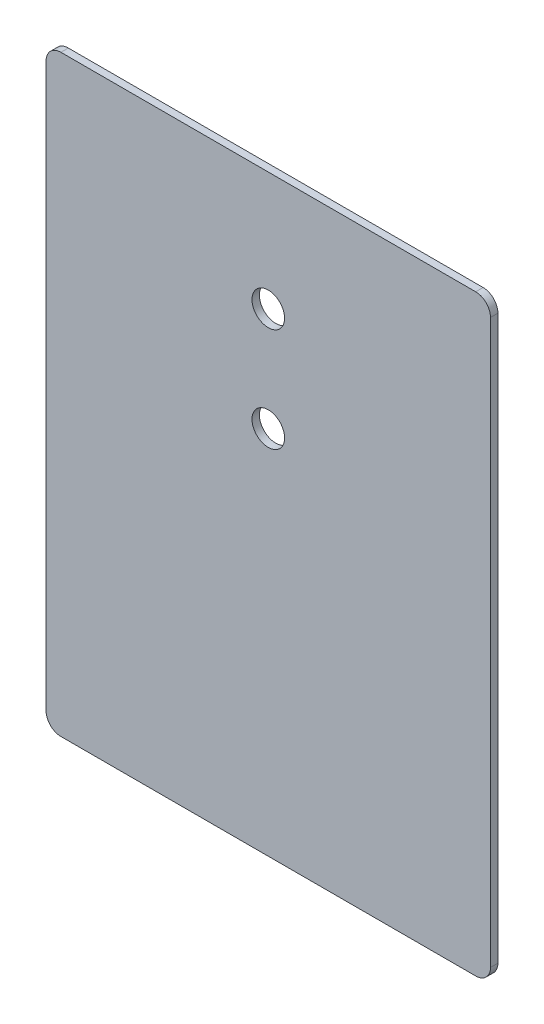
ISO-10303-21;
HEADER;
FILE_DESCRIPTION(('STEP AP214'),'2;1');
FILE_NAME('part.step','',(''),(''),'','','');
FILE_SCHEMA(('AUTOMOTIVE_DESIGN { 1 0 10303 214 1 1 1 1 }'));
ENDSEC;
DATA;
#1=APPLICATION_CONTEXT('core data for automotive mechanical design processes');
#2=APPLICATION_PROTOCOL_DEFINITION('international standard','automotive_design',2000,#1);
#3=PRODUCT_CONTEXT('',#1,'mechanical');
#4=PRODUCT('Part','Part','',(#3));
#5=PRODUCT_RELATED_PRODUCT_CATEGORY('part','',(#4));
#6=PRODUCT_DEFINITION_FORMATION('','',#4);
#7=PRODUCT_DEFINITION_CONTEXT('part definition',#1,'design');
#8=PRODUCT_DEFINITION('design','',#6,#7);
#9=PRODUCT_DEFINITION_SHAPE('','',#8);
#10=(LENGTH_UNIT() NAMED_UNIT(*) SI_UNIT(.MILLI.,.METRE.));
#11=(NAMED_UNIT(*) PLANE_ANGLE_UNIT() SI_UNIT($,.RADIAN.));
#12=(NAMED_UNIT(*) SI_UNIT($,.STERADIAN.) SOLID_ANGLE_UNIT());
#13=UNCERTAINTY_MEASURE_WITH_UNIT(LENGTH_MEASURE(1.E-05),#10,'distance_accuracy_value','');
#14=(GEOMETRIC_REPRESENTATION_CONTEXT(3) GLOBAL_UNCERTAINTY_ASSIGNED_CONTEXT((#13)) GLOBAL_UNIT_ASSIGNED_CONTEXT((#10,
#11,#12)) REPRESENTATION_CONTEXT('',''));
#15=CARTESIAN_POINT('',(0.,0.,0.));
#16=DIRECTION('',(0.,0.,1.));
#17=DIRECTION('',(1.,0.,0.));
#18=AXIS2_PLACEMENT_3D('',#15,#16,#17);
#19=CARTESIAN_POINT('',(-188.888888888889,284.044438103836,5.));
#20=DIRECTION('',(1.,0.,0.));
#21=DIRECTION('',(0.,1.,0.));
#22=AXIS2_PLACEMENT_3D('',#19,#20,#21);
#23=PLANE('',#22);
#24=DIRECTION('',(0.,-1.,0.));
#25=VECTOR('',#24,1.);
#26=CARTESIAN_POINT('',(-188.888888888889,284.044438103836,0.));
#27=LINE('',#26,#25);
#28=CARTESIAN_POINT('',(-188.888888888889,274.044438103836,0.));
#29=VERTEX_POINT('',#28);
#30=CARTESIAN_POINT('',(-188.888888888889,-105.955561896164,0.));
#31=VERTEX_POINT('',#30);
#32=EDGE_CURVE('E160',#29,#31,#27,.T.);
#33=ORIENTED_EDGE('',*,*,#32,.T.);
#34=DIRECTION('',(0.,0.,-1.));
#35=VECTOR('',#34,1.);
#36=CARTESIAN_POINT('',(-188.888888888889,-105.955561896164,5.));
#37=LINE('',#36,#35);
#38=CARTESIAN_POINT('',(-188.888888888889,-105.955561896164,5.));
#39=VERTEX_POINT('',#38);
#40=EDGE_CURVE('E147',#31,#39,#37,.F.);
#41=ORIENTED_EDGE('',*,*,#40,.T.);
#42=DIRECTION('',(0.,-1.,0.));
#43=VECTOR('',#42,1.);
#44=CARTESIAN_POINT('',(-188.888888888889,284.044438103836,5.));
#45=LINE('',#44,#43);
#46=CARTESIAN_POINT('',(-188.888888888889,274.044438103836,5.));
#47=VERTEX_POINT('',#46);
#48=EDGE_CURVE('E162',#47,#39,#45,.T.);
#49=ORIENTED_EDGE('',*,*,#48,.F.);
#50=DIRECTION('',(0.,0.,-1.));
#51=VECTOR('',#50,1.);
#52=CARTESIAN_POINT('',(-188.888888888889,274.044438103836,0.));
#53=LINE('',#52,#51);
#54=EDGE_CURVE('E144',#47,#29,#53,.T.);
#55=ORIENTED_EDGE('',*,*,#54,.T.);
#56=EDGE_LOOP('',(#33,#41,#49,#55));
#57=FACE_BOUND('',#56,.T.);
#58=ADVANCED_FACE('F35',(#57),#23,.F.);
#59=CARTESIAN_POINT('',(-188.888888888889,-115.955561896164,5.));
#60=DIRECTION('',(0.,1.,0.));
#61=DIRECTION('',(0.,0.,1.));
#62=AXIS2_PLACEMENT_3D('',#59,#60,#61);
#63=PLANE('',#62);
#64=DIRECTION('',(1.,0.,0.));
#65=VECTOR('',#64,1.);
#66=CARTESIAN_POINT('',(-188.888888888889,-115.955561896164,0.));
#67=LINE('',#66,#65);
#68=CARTESIAN_POINT('',(-178.888888888889,-115.955561896164,0.));
#69=VERTEX_POINT('',#68);
#70=CARTESIAN_POINT('',(101.111111111111,-115.955561896164,0.));
#71=VERTEX_POINT('',#70);
#72=EDGE_CURVE('E118',#69,#71,#67,.T.);
#73=ORIENTED_EDGE('',*,*,#72,.T.);
#74=DIRECTION('',(0.,0.,-1.));
#75=VECTOR('',#74,1.);
#76=CARTESIAN_POINT('',(101.111111111111,-115.955561896164,5.));
#77=LINE('',#76,#75);
#78=CARTESIAN_POINT('',(101.111111111111,-115.955561896164,5.));
#79=VERTEX_POINT('',#78);
#80=EDGE_CURVE('E135',#71,#79,#77,.F.);
#81=ORIENTED_EDGE('',*,*,#80,.T.);
#82=DIRECTION('',(1.,0.,0.));
#83=VECTOR('',#82,1.);
#84=CARTESIAN_POINT('',(-188.888888888889,-115.955561896164,5.));
#85=LINE('',#84,#83);
#86=CARTESIAN_POINT('',(-178.888888888889,-115.955561896164,5.));
#87=VERTEX_POINT('',#86);
#88=EDGE_CURVE('E173',#87,#79,#85,.T.);
#89=ORIENTED_EDGE('',*,*,#88,.F.);
#90=DIRECTION('',(0.,0.,-1.));
#91=VECTOR('',#90,1.);
#92=CARTESIAN_POINT('',(-178.888888888889,-115.955561896164,5.));
#93=LINE('',#92,#91);
#94=EDGE_CURVE('E132',#87,#69,#93,.T.);
#95=ORIENTED_EDGE('',*,*,#94,.T.);
#96=EDGE_LOOP('',(#73,#81,#89,#95));
#97=FACE_BOUND('',#96,.T.);
#98=ADVANCED_FACE('F198',(#97),#63,.F.);
#99=CARTESIAN_POINT('',(111.111111111111,284.044438103836,5.));
#100=DIRECTION('',(1.,0.,0.));
#101=DIRECTION('',(0.,1.,0.));
#102=AXIS2_PLACEMENT_3D('',#99,#100,#101);
#103=PLANE('',#102);
#104=DIRECTION('',(0.,-1.,0.));
#105=VECTOR('',#104,1.);
#106=CARTESIAN_POINT('',(111.111111111111,284.044438103836,5.));
#107=LINE('',#106,#105);
#108=CARTESIAN_POINT('',(111.111111111111,274.044438103836,5.));
#109=VERTEX_POINT('',#108);
#110=CARTESIAN_POINT('',(111.111111111111,-105.955561896164,5.));
#111=VERTEX_POINT('',#110);
#112=EDGE_CURVE('E123',#109,#111,#107,.T.);
#113=ORIENTED_EDGE('',*,*,#112,.T.);
#114=DIRECTION('',(0.,0.,-1.));
#115=VECTOR('',#114,1.);
#116=CARTESIAN_POINT('',(111.111111111111,-105.955561896164,0.));
#117=LINE('',#116,#115);
#118=CARTESIAN_POINT('',(111.111111111111,-105.955561896164,0.));
#119=VERTEX_POINT('',#118);
#120=EDGE_CURVE('E110',#111,#119,#117,.T.);
#121=ORIENTED_EDGE('',*,*,#120,.T.);
#122=DIRECTION('',(0.,-1.,0.));
#123=VECTOR('',#122,1.);
#124=CARTESIAN_POINT('',(111.111111111111,284.044438103836,0.));
#125=LINE('',#124,#123);
#126=CARTESIAN_POINT('',(111.111111111111,274.044438103836,0.));
#127=VERTEX_POINT('',#126);
#128=EDGE_CURVE('E103',#127,#119,#125,.T.);
#129=ORIENTED_EDGE('',*,*,#128,.F.);
#130=DIRECTION('',(0.,0.,-1.));
#131=VECTOR('',#130,1.);
#132=CARTESIAN_POINT('',(111.111111111111,274.044438103836,5.));
#133=LINE('',#132,#131);
#134=EDGE_CURVE('E116',#127,#109,#133,.F.);
#135=ORIENTED_EDGE('',*,*,#134,.T.);
#136=EDGE_LOOP('',(#113,#121,#129,#135));
#137=FACE_BOUND('',#136,.T.);
#138=ADVANCED_FACE('F115',(#137),#103,.T.);
#139=CARTESIAN_POINT('',(-188.888888888889,284.044438103836,5.));
#140=DIRECTION('',(0.,1.,0.));
#141=DIRECTION('',(0.,0.,1.));
#142=AXIS2_PLACEMENT_3D('',#139,#140,#141);
#143=PLANE('',#142);
#144=DIRECTION('',(1.,0.,0.));
#145=VECTOR('',#144,1.);
#146=CARTESIAN_POINT('',(-188.888888888889,284.044438103836,0.));
#147=LINE('',#146,#145);
#148=CARTESIAN_POINT('',(-178.888888888889,284.044438103836,0.));
#149=VERTEX_POINT('',#148);
#150=CARTESIAN_POINT('',(101.111111111111,284.044438103836,0.));
#151=VERTEX_POINT('',#150);
#152=EDGE_CURVE('E104',#149,#151,#147,.T.);
#153=ORIENTED_EDGE('',*,*,#152,.F.);
#154=DIRECTION('',(0.,0.,-1.));
#155=VECTOR('',#154,1.);
#156=CARTESIAN_POINT('',(-178.888888888889,284.044438103836,5.));
#157=LINE('',#156,#155);
#158=CARTESIAN_POINT('',(-178.888888888889,284.044438103836,5.));
#159=VERTEX_POINT('',#158);
#160=EDGE_CURVE('E11',#149,#159,#157,.F.);
#161=ORIENTED_EDGE('',*,*,#160,.T.);
#162=DIRECTION('',(1.,0.,0.));
#163=VECTOR('',#162,1.);
#164=CARTESIAN_POINT('',(-188.888888888889,284.044438103836,5.));
#165=LINE('',#164,#163);
#166=CARTESIAN_POINT('',(101.111111111111,284.044438103836,5.));
#167=VERTEX_POINT('',#166);
#168=EDGE_CURVE('E120',#159,#167,#165,.T.);
#169=ORIENTED_EDGE('',*,*,#168,.T.);
#170=DIRECTION('',(0.,0.,-1.));
#171=VECTOR('',#170,1.);
#172=CARTESIAN_POINT('',(101.111111111111,284.044438103836,5.));
#173=LINE('',#172,#171);
#174=EDGE_CURVE('E43',#167,#151,#173,.T.);
#175=ORIENTED_EDGE('',*,*,#174,.T.);
#176=EDGE_LOOP('',(#153,#161,#169,#175));
#177=FACE_BOUND('',#176,.T.);
#178=ADVANCED_FACE('F148',(#177),#143,.T.);
#179=CARTESIAN_POINT('',(0.,0.,5.));
#180=DIRECTION('',(0.,0.,1.));
#181=DIRECTION('',(1.,0.,0.));
#182=AXIS2_PLACEMENT_3D('',#179,#180,#181);
#183=PLANE('',#182);
#184=CARTESIAN_POINT('',(-38.8888888888888,204.044438103836,5.));
#185=DIRECTION('',(0.,0.,1.));
#186=DIRECTION('',(1.,0.,0.));
#187=AXIS2_PLACEMENT_3D('',#184,#185,#186);
#188=CIRCLE('',#187,11.);
#189=CARTESIAN_POINT('',(-27.8888888888888,204.044438103836,5.));
#190=VERTEX_POINT('',#189);
#191=EDGE_CURVE('E164',#190,#190,#188,.T.);
#192=ORIENTED_EDGE('',*,*,#191,.F.);
#193=EDGE_LOOP('',(#192));
#194=FACE_BOUND('',#193,.T.);
#195=CARTESIAN_POINT('',(-38.8888888888888,134.044438103836,5.));
#196=DIRECTION('',(0.,0.,1.));
#197=DIRECTION('',(1.,0.,0.));
#198=AXIS2_PLACEMENT_3D('',#195,#196,#197);
#199=CIRCLE('',#198,11.);
#200=CARTESIAN_POINT('',(-27.8888888888887,134.044438103836,5.));
#201=VERTEX_POINT('',#200);
#202=EDGE_CURVE('E179',#201,#201,#199,.T.);
#203=ORIENTED_EDGE('',*,*,#202,.F.);
#204=EDGE_LOOP('',(#203));
#205=FACE_BOUND('',#204,.T.);
#206=ORIENTED_EDGE('',*,*,#88,.T.);
#207=CARTESIAN_POINT('',(101.111111111111,-105.955561896164,5.));
#208=DIRECTION('',(0.,0.,1.));
#209=DIRECTION('',(1.,0.,0.));
#210=AXIS2_PLACEMENT_3D('',#207,#208,#209);
#211=CIRCLE('',#210,10.);
#212=EDGE_CURVE('E142',#79,#111,#211,.T.);
#213=ORIENTED_EDGE('',*,*,#212,.T.);
#214=ORIENTED_EDGE('',*,*,#112,.F.);
#215=CARTESIAN_POINT('',(101.111111111111,274.044438103836,5.));
#216=DIRECTION('',(0.,0.,1.));
#217=DIRECTION('',(1.,0.,0.));
#218=AXIS2_PLACEMENT_3D('',#215,#216,#217);
#219=CIRCLE('',#218,10.);
#220=EDGE_CURVE('E50',#109,#167,#219,.T.);
#221=ORIENTED_EDGE('',*,*,#220,.T.);
#222=ORIENTED_EDGE('',*,*,#168,.F.);
#223=CARTESIAN_POINT('',(-178.888888888889,274.044438103836,5.));
#224=DIRECTION('',(0.,0.,1.));
#225=DIRECTION('',(1.,0.,0.));
#226=AXIS2_PLACEMENT_3D('',#223,#224,#225);
#227=CIRCLE('',#226,10.);
#228=EDGE_CURVE('E138',#159,#47,#227,.T.);
#229=ORIENTED_EDGE('',*,*,#228,.T.);
#230=ORIENTED_EDGE('',*,*,#48,.T.);
#231=CARTESIAN_POINT('',(-178.888888888889,-105.955561896164,5.));
#232=DIRECTION('',(0.,0.,1.));
#233=DIRECTION('',(1.,0.,0.));
#234=AXIS2_PLACEMENT_3D('',#231,#232,#233);
#235=CIRCLE('',#234,10.);
#236=EDGE_CURVE('E140',#39,#87,#235,.T.);
#237=ORIENTED_EDGE('',*,*,#236,.T.);
#238=EDGE_LOOP('',(#206,#213,#214,#221,#222,#229,#230,#237));
#239=FACE_BOUND('',#238,.T.);
#240=ADVANCED_FACE('F151',(#194,#205,#239),#183,.T.);
#241=CARTESIAN_POINT('',(0.,0.,0.));
#242=DIRECTION('',(0.,0.,1.));
#243=DIRECTION('',(1.,0.,0.));
#244=AXIS2_PLACEMENT_3D('',#241,#242,#243);
#245=PLANE('',#244);
#246=CARTESIAN_POINT('',(-38.8888888888888,204.044438103836,0.));
#247=DIRECTION('',(0.,0.,1.));
#248=DIRECTION('',(1.,0.,0.));
#249=AXIS2_PLACEMENT_3D('',#246,#247,#248);
#250=CIRCLE('',#249,11.);
#251=CARTESIAN_POINT('',(-27.8888888888888,204.044438103836,0.));
#252=VERTEX_POINT('',#251);
#253=EDGE_CURVE('E169',#252,#252,#250,.T.);
#254=ORIENTED_EDGE('',*,*,#253,.T.);
#255=EDGE_LOOP('',(#254));
#256=FACE_BOUND('',#255,.T.);
#257=CARTESIAN_POINT('',(-38.8888888888888,134.044438103836,0.));
#258=DIRECTION('',(0.,0.,1.));
#259=DIRECTION('',(1.,0.,0.));
#260=AXIS2_PLACEMENT_3D('',#257,#258,#259);
#261=CIRCLE('',#260,11.);
#262=CARTESIAN_POINT('',(-27.8888888888887,134.044438103836,0.));
#263=VERTEX_POINT('',#262);
#264=EDGE_CURVE('E176',#263,#263,#261,.T.);
#265=ORIENTED_EDGE('',*,*,#264,.T.);
#266=EDGE_LOOP('',(#265));
#267=FACE_BOUND('',#266,.T.);
#268=ORIENTED_EDGE('',*,*,#128,.T.);
#269=CARTESIAN_POINT('',(101.111111111111,-105.955561896164,0.));
#270=DIRECTION('',(0.,0.,1.));
#271=DIRECTION('',(1.,0.,0.));
#272=AXIS2_PLACEMENT_3D('',#269,#270,#271);
#273=CIRCLE('',#272,10.);
#274=EDGE_CURVE('E130',#119,#71,#273,.F.);
#275=ORIENTED_EDGE('',*,*,#274,.T.);
#276=ORIENTED_EDGE('',*,*,#72,.F.);
#277=CARTESIAN_POINT('',(-178.888888888889,-105.955561896164,0.));
#278=DIRECTION('',(0.,0.,1.));
#279=DIRECTION('',(1.,0.,0.));
#280=AXIS2_PLACEMENT_3D('',#277,#278,#279);
#281=CIRCLE('',#280,10.);
#282=EDGE_CURVE('E128',#69,#31,#281,.F.);
#283=ORIENTED_EDGE('',*,*,#282,.T.);
#284=ORIENTED_EDGE('',*,*,#32,.F.);
#285=CARTESIAN_POINT('',(-178.888888888889,274.044438103836,0.));
#286=DIRECTION('',(0.,0.,1.));
#287=DIRECTION('',(1.,0.,0.));
#288=AXIS2_PLACEMENT_3D('',#285,#286,#287);
#289=CIRCLE('',#288,10.);
#290=EDGE_CURVE('E109',#29,#149,#289,.F.);
#291=ORIENTED_EDGE('',*,*,#290,.T.);
#292=ORIENTED_EDGE('',*,*,#152,.T.);
#293=CARTESIAN_POINT('',(101.111111111111,274.044438103836,0.));
#294=DIRECTION('',(0.,0.,1.));
#295=DIRECTION('',(1.,0.,0.));
#296=AXIS2_PLACEMENT_3D('',#293,#294,#295);
#297=CIRCLE('',#296,10.);
#298=EDGE_CURVE('E100',#151,#127,#297,.F.);
#299=ORIENTED_EDGE('',*,*,#298,.T.);
#300=EDGE_LOOP('',(#268,#275,#276,#283,#284,#291,#292,#299));
#301=FACE_BOUND('',#300,.T.);
#302=ADVANCED_FACE('F102',(#256,#267,#301),#245,.F.);
#303=CARTESIAN_POINT('',(101.111111111111,-105.955561896164,5.));
#304=DIRECTION('',(0.,0.,1.));
#305=DIRECTION('',(1.,0.,0.));
#306=AXIS2_PLACEMENT_3D('',#303,#304,#305);
#307=CYLINDRICAL_SURFACE('',#306,10.);
#308=ORIENTED_EDGE('',*,*,#212,.F.);
#309=ORIENTED_EDGE('',*,*,#80,.F.);
#310=ORIENTED_EDGE('',*,*,#274,.F.);
#311=ORIENTED_EDGE('',*,*,#120,.F.);
#312=EDGE_LOOP('',(#308,#309,#310,#311));
#313=FACE_BOUND('',#312,.T.);
#314=ADVANCED_FACE('F207',(#313),#307,.T.);
#315=CARTESIAN_POINT('',(-178.888888888889,-105.955561896164,5.));
#316=DIRECTION('',(0.,0.,-1.));
#317=DIRECTION('',(-1.,0.,0.));
#318=AXIS2_PLACEMENT_3D('',#315,#316,#317);
#319=CYLINDRICAL_SURFACE('',#318,10.);
#320=ORIENTED_EDGE('',*,*,#236,.F.);
#321=ORIENTED_EDGE('',*,*,#40,.F.);
#322=ORIENTED_EDGE('',*,*,#282,.F.);
#323=ORIENTED_EDGE('',*,*,#94,.F.);
#324=EDGE_LOOP('',(#320,#321,#322,#323));
#325=FACE_BOUND('',#324,.T.);
#326=ADVANCED_FACE('F210',(#325),#319,.T.);
#327=CARTESIAN_POINT('',(-178.888888888889,274.044438103836,5.));
#328=DIRECTION('',(0.,0.,1.));
#329=DIRECTION('',(1.,0.,0.));
#330=AXIS2_PLACEMENT_3D('',#327,#328,#329);
#331=CYLINDRICAL_SURFACE('',#330,10.);
#332=ORIENTED_EDGE('',*,*,#228,.F.);
#333=ORIENTED_EDGE('',*,*,#160,.F.);
#334=ORIENTED_EDGE('',*,*,#290,.F.);
#335=ORIENTED_EDGE('',*,*,#54,.F.);
#336=EDGE_LOOP('',(#332,#333,#334,#335));
#337=FACE_BOUND('',#336,.T.);
#338=ADVANCED_FACE('F156',(#337),#331,.T.);
#339=CARTESIAN_POINT('',(101.111111111111,274.044438103836,5.));
#340=DIRECTION('',(0.,0.,-1.));
#341=DIRECTION('',(-1.,0.,0.));
#342=AXIS2_PLACEMENT_3D('',#339,#340,#341);
#343=CYLINDRICAL_SURFACE('',#342,10.);
#344=ORIENTED_EDGE('',*,*,#220,.F.);
#345=ORIENTED_EDGE('',*,*,#134,.F.);
#346=ORIENTED_EDGE('',*,*,#298,.F.);
#347=ORIENTED_EDGE('',*,*,#174,.F.);
#348=EDGE_LOOP('',(#344,#345,#346,#347));
#349=FACE_BOUND('',#348,.T.);
#350=ADVANCED_FACE('F37',(#349),#343,.T.);
#351=CARTESIAN_POINT('',(-38.8888888888888,134.044438103836,5.));
#352=DIRECTION('',(0.,0.,-1.));
#353=DIRECTION('',(-1.,0.,0.));
#354=AXIS2_PLACEMENT_3D('',#351,#352,#353);
#355=CYLINDRICAL_SURFACE('',#354,11.);
#356=ORIENTED_EDGE('',*,*,#202,.T.);
#357=EDGE_LOOP('',(#356));
#358=FACE_BOUND('',#357,.T.);
#359=ORIENTED_EDGE('',*,*,#264,.F.);
#360=EDGE_LOOP('',(#359));
#361=FACE_BOUND('',#360,.T.);
#362=ADVANCED_FACE('F189',(#358,#361),#355,.F.);
#363=CARTESIAN_POINT('',(-38.8888888888888,204.044438103836,5.));
#364=DIRECTION('',(0.,0.,-1.));
#365=DIRECTION('',(-1.,0.,0.));
#366=AXIS2_PLACEMENT_3D('',#363,#364,#365);
#367=CYLINDRICAL_SURFACE('',#366,11.);
#368=ORIENTED_EDGE('',*,*,#191,.T.);
#369=EDGE_LOOP('',(#368));
#370=FACE_BOUND('',#369,.T.);
#371=ORIENTED_EDGE('',*,*,#253,.F.);
#372=EDGE_LOOP('',(#371));
#373=FACE_BOUND('',#372,.T.);
#374=ADVANCED_FACE('F187',(#370,#373),#367,.F.);
#375=CLOSED_SHELL('',(#58,#98,#138,#178,#240,#302,#314,#326,#338,#350,#362,#374));
#376=MANIFOLD_SOLID_BREP('B2',#375);
#377=ADVANCED_BREP_SHAPE_REPRESENTATION('',(#18,#376),#14);
#378=SHAPE_DEFINITION_REPRESENTATION(#9,#377);
ENDSEC;
END-ISO-10303-21;
